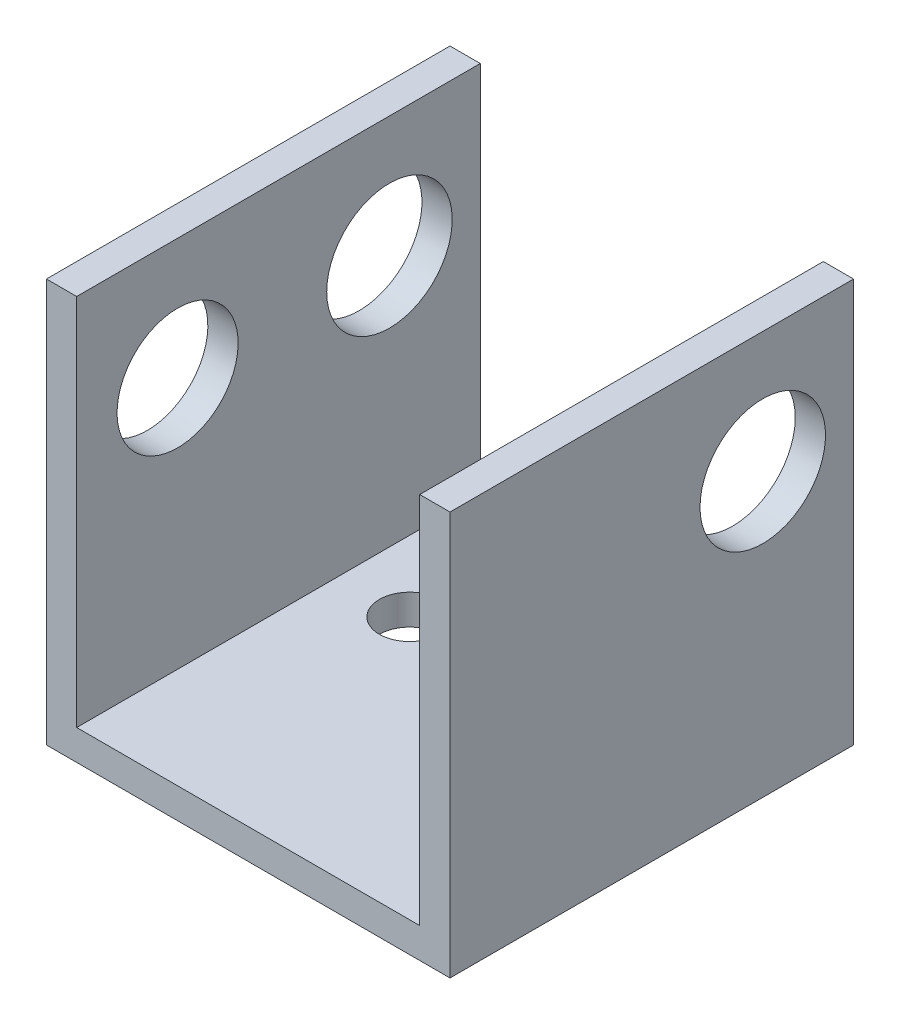
ISO-10303-21;
HEADER;
FILE_DESCRIPTION(('STEP AP214'),'2;1');
FILE_NAME('part.step','',(''),(''),'','','');
FILE_SCHEMA(('AUTOMOTIVE_DESIGN { 1 0 10303 214 1 1 1 1 }'));
ENDSEC;
DATA;
#1=APPLICATION_CONTEXT('core data for automotive mechanical design processes');
#2=APPLICATION_PROTOCOL_DEFINITION('international standard','automotive_design',2000,#1);
#3=PRODUCT_CONTEXT('',#1,'mechanical');
#4=PRODUCT('Part','Part','',(#3));
#5=PRODUCT_RELATED_PRODUCT_CATEGORY('part','',(#4));
#6=PRODUCT_DEFINITION_FORMATION('','',#4);
#7=PRODUCT_DEFINITION_CONTEXT('part definition',#1,'design');
#8=PRODUCT_DEFINITION('design','',#6,#7);
#9=PRODUCT_DEFINITION_SHAPE('','',#8);
#10=(LENGTH_UNIT() NAMED_UNIT(*) SI_UNIT(.MILLI.,.METRE.));
#11=(NAMED_UNIT(*) PLANE_ANGLE_UNIT() SI_UNIT($,.RADIAN.));
#12=(NAMED_UNIT(*) SI_UNIT($,.STERADIAN.) SOLID_ANGLE_UNIT());
#13=UNCERTAINTY_MEASURE_WITH_UNIT(LENGTH_MEASURE(1.E-05),#10,'distance_accuracy_value','');
#14=(GEOMETRIC_REPRESENTATION_CONTEXT(3) GLOBAL_UNCERTAINTY_ASSIGNED_CONTEXT((#13)) GLOBAL_UNIT_ASSIGNED_CONTEXT((#10,
#11,#12)) REPRESENTATION_CONTEXT('',''));
#15=CARTESIAN_POINT('',(0.,0.,0.));
#16=DIRECTION('',(0.,0.,1.));
#17=DIRECTION('',(1.,0.,0.));
#18=AXIS2_PLACEMENT_3D('',#15,#16,#17);
#19=CARTESIAN_POINT('',(-31.1485585296292,-16.6161569826708,20.));
#20=DIRECTION('',(1.,0.,0.));
#21=DIRECTION('',(0.,0.,-1.));
#22=AXIS2_PLACEMENT_3D('',#19,#20,#21);
#23=PLANE('',#22);
#24=CARTESIAN_POINT('',(-31.1485585296292,-2.61615698267076,4.5));
#25=DIRECTION('',(-1.,0.,0.));
#26=DIRECTION('',(0.,0.,1.));
#27=AXIS2_PLACEMENT_3D('',#24,#25,#26);
#28=CIRCLE('',#27,3.11);
#29=CARTESIAN_POINT('',(-31.1485585296292,-2.61615698267076,7.61));
#30=VERTEX_POINT('',#29);
#31=EDGE_CURVE('E197',#30,#30,#28,.T.);
#32=ORIENTED_EDGE('',*,*,#31,.F.);
#33=EDGE_LOOP('',(#32));
#34=FACE_BOUND('',#33,.T.);
#35=CARTESIAN_POINT('',(-31.1485585296292,-2.61615698267076,15.));
#36=DIRECTION('',(1.,0.,0.));
#37=DIRECTION('',(0.,1.,0.));
#38=AXIS2_PLACEMENT_3D('',#35,#36,#37);
#39=CIRCLE('',#38,3.);
#40=CARTESIAN_POINT('',(-31.1485585296292,0.383843017329241,15.));
#41=VERTEX_POINT('',#40);
#42=EDGE_CURVE('E186',#41,#41,#39,.T.);
#43=ORIENTED_EDGE('',*,*,#42,.T.);
#44=EDGE_LOOP('',(#43));
#45=FACE_BOUND('',#44,.T.);
#46=DIRECTION('',(0.,-1.,0.));
#47=VECTOR('',#46,1.);
#48=CARTESIAN_POINT('',(-31.1485585296292,-16.6161569826708,0.));
#49=LINE('',#48,#47);
#50=CARTESIAN_POINT('',(-31.1485585296292,3.38384301732924,0.));
#51=VERTEX_POINT('',#50);
#52=CARTESIAN_POINT('',(-31.1485585296292,-16.6161569826708,0.));
#53=VERTEX_POINT('',#52);
#54=EDGE_CURVE('E128',#51,#53,#49,.T.);
#55=ORIENTED_EDGE('',*,*,#54,.T.);
#56=DIRECTION('',(0.,0.,-1.));
#57=VECTOR('',#56,1.);
#58=CARTESIAN_POINT('',(-31.1485585296292,-16.6161569826708,20.));
#59=LINE('',#58,#57);
#60=CARTESIAN_POINT('',(-31.1485585296292,-16.6161569826708,20.));
#61=VERTEX_POINT('',#60);
#62=EDGE_CURVE('E11',#61,#53,#59,.T.);
#63=ORIENTED_EDGE('',*,*,#62,.F.);
#64=DIRECTION('',(0.,-1.,0.));
#65=VECTOR('',#64,1.);
#66=CARTESIAN_POINT('',(-31.1485585296292,-16.6161569826708,20.));
#67=LINE('',#66,#65);
#68=CARTESIAN_POINT('',(-31.1485585296292,3.38384301732924,20.));
#69=VERTEX_POINT('',#68);
#70=EDGE_CURVE('E143',#69,#61,#67,.T.);
#71=ORIENTED_EDGE('',*,*,#70,.F.);
#72=DIRECTION('',(0.,0.,-1.));
#73=VECTOR('',#72,1.);
#74=CARTESIAN_POINT('',(-31.1485585296292,3.38384301732924,20.));
#75=LINE('',#74,#73);
#76=EDGE_CURVE('E124',#69,#51,#75,.T.);
#77=ORIENTED_EDGE('',*,*,#76,.T.);
#78=EDGE_LOOP('',(#55,#63,#71,#77));
#79=FACE_BOUND('',#78,.T.);
#80=ADVANCED_FACE('F31',(#34,#45,#79),#23,.F.);
#81=CARTESIAN_POINT('',(-11.1485585296292,-16.6161569826708,20.));
#82=DIRECTION('',(0.,1.,0.));
#83=DIRECTION('',(-1.,0.,0.));
#84=AXIS2_PLACEMENT_3D('',#81,#82,#83);
#85=PLANE('',#84);
#86=CARTESIAN_POINT('',(-16.1485585296292,-16.6161569826708,13.));
#87=DIRECTION('',(0.,1.,0.));
#88=DIRECTION('',(-1.,0.,0.));
#89=AXIS2_PLACEMENT_3D('',#86,#87,#88);
#90=CIRCLE('',#89,1.5);
#91=CARTESIAN_POINT('',(-17.6485585296292,-16.6161569826708,13.));
#92=VERTEX_POINT('',#91);
#93=EDGE_CURVE('E180',#92,#92,#90,.T.);
#94=ORIENTED_EDGE('',*,*,#93,.T.);
#95=EDGE_LOOP('',(#94));
#96=FACE_BOUND('',#95,.T.);
#97=CARTESIAN_POINT('',(-26.1485585296292,-16.6161569826708,7.));
#98=DIRECTION('',(0.,1.,0.));
#99=DIRECTION('',(-1.,0.,0.));
#100=AXIS2_PLACEMENT_3D('',#97,#98,#99);
#101=CIRCLE('',#100,1.5);
#102=CARTESIAN_POINT('',(-27.6485585296292,-16.6161569826708,7.));
#103=VERTEX_POINT('',#102);
#104=EDGE_CURVE('E132',#103,#103,#101,.T.);
#105=ORIENTED_EDGE('',*,*,#104,.T.);
#106=EDGE_LOOP('',(#105));
#107=FACE_BOUND('',#106,.T.);
#108=DIRECTION('',(1.,0.,0.));
#109=VECTOR('',#108,1.);
#110=CARTESIAN_POINT('',(-11.1485585296292,-16.6161569826708,0.));
#111=LINE('',#110,#109);
#112=CARTESIAN_POINT('',(-11.1485585296292,-16.6161569826708,0.));
#113=VERTEX_POINT('',#112);
#114=EDGE_CURVE('E131',#53,#113,#111,.T.);
#115=ORIENTED_EDGE('',*,*,#114,.T.);
#116=DIRECTION('',(0.,0.,-1.));
#117=VECTOR('',#116,1.);
#118=CARTESIAN_POINT('',(-11.1485585296292,-16.6161569826708,20.));
#119=LINE('',#118,#117);
#120=CARTESIAN_POINT('',(-11.1485585296292,-16.6161569826708,20.));
#121=VERTEX_POINT('',#120);
#122=EDGE_CURVE('E40',#121,#113,#119,.T.);
#123=ORIENTED_EDGE('',*,*,#122,.F.);
#124=DIRECTION('',(1.,0.,0.));
#125=VECTOR('',#124,1.);
#126=CARTESIAN_POINT('',(-11.1485585296292,-16.6161569826708,20.));
#127=LINE('',#126,#125);
#128=EDGE_CURVE('E91',#61,#121,#127,.T.);
#129=ORIENTED_EDGE('',*,*,#128,.F.);
#130=ORIENTED_EDGE('',*,*,#62,.T.);
#131=EDGE_LOOP('',(#115,#123,#129,#130));
#132=FACE_BOUND('',#131,.T.);
#133=ADVANCED_FACE('F224',(#96,#107,#132),#85,.F.);
#134=CARTESIAN_POINT('',(-11.1485585296292,3.38384301732925,20.));
#135=DIRECTION('',(-1.,0.,0.));
#136=DIRECTION('',(0.,-1.,0.));
#137=AXIS2_PLACEMENT_3D('',#134,#135,#136);
#138=PLANE('',#137);
#139=CARTESIAN_POINT('',(-11.1485585296292,-2.61615698267076,4.5));
#140=DIRECTION('',(-1.,0.,0.));
#141=DIRECTION('',(0.,0.,1.));
#142=AXIS2_PLACEMENT_3D('',#139,#140,#141);
#143=CIRCLE('',#142,3.11);
#144=CARTESIAN_POINT('',(-11.1485585296292,-2.61615698267076,7.61));
#145=VERTEX_POINT('',#144);
#146=EDGE_CURVE('E200',#145,#145,#143,.T.);
#147=ORIENTED_EDGE('',*,*,#146,.T.);
#148=EDGE_LOOP('',(#147));
#149=FACE_BOUND('',#148,.T.);
#150=DIRECTION('',(0.,1.,0.));
#151=VECTOR('',#150,1.);
#152=CARTESIAN_POINT('',(-11.1485585296292,3.38384301732925,0.));
#153=LINE('',#152,#151);
#154=CARTESIAN_POINT('',(-11.1485585296292,3.38384301732925,0.));
#155=VERTEX_POINT('',#154);
#156=EDGE_CURVE('E134',#113,#155,#153,.T.);
#157=ORIENTED_EDGE('',*,*,#156,.T.);
#158=DIRECTION('',(0.,0.,-1.));
#159=VECTOR('',#158,1.);
#160=CARTESIAN_POINT('',(-11.1485585296292,3.38384301732925,20.));
#161=LINE('',#160,#159);
#162=CARTESIAN_POINT('',(-11.1485585296292,3.38384301732925,20.));
#163=VERTEX_POINT('',#162);
#164=EDGE_CURVE('E150',#163,#155,#161,.T.);
#165=ORIENTED_EDGE('',*,*,#164,.F.);
#166=DIRECTION('',(0.,1.,0.));
#167=VECTOR('',#166,1.);
#168=CARTESIAN_POINT('',(-11.1485585296292,3.38384301732925,20.));
#169=LINE('',#168,#167);
#170=EDGE_CURVE('E159',#121,#163,#169,.T.);
#171=ORIENTED_EDGE('',*,*,#170,.F.);
#172=ORIENTED_EDGE('',*,*,#122,.T.);
#173=EDGE_LOOP('',(#157,#165,#171,#172));
#174=FACE_BOUND('',#173,.T.);
#175=ADVANCED_FACE('F157',(#149,#174),#138,.F.);
#176=CARTESIAN_POINT('',(-12.6485585296292,3.38384301732925,20.));
#177=DIRECTION('',(0.,-1.,0.));
#178=DIRECTION('',(0.,0.,-1.));
#179=AXIS2_PLACEMENT_3D('',#176,#177,#178);
#180=PLANE('',#179);
#181=DIRECTION('',(-1.,0.,0.));
#182=VECTOR('',#181,1.);
#183=CARTESIAN_POINT('',(-12.6485585296292,3.38384301732925,0.));
#184=LINE('',#183,#182);
#185=CARTESIAN_POINT('',(-12.6485585296292,3.38384301732925,0.));
#186=VERTEX_POINT('',#185);
#187=EDGE_CURVE('E136',#155,#186,#184,.T.);
#188=ORIENTED_EDGE('',*,*,#187,.T.);
#189=DIRECTION('',(0.,0.,-1.));
#190=VECTOR('',#189,1.);
#191=CARTESIAN_POINT('',(-12.6485585296292,3.38384301732925,20.));
#192=LINE('',#191,#190);
#193=CARTESIAN_POINT('',(-12.6485585296292,3.38384301732925,20.));
#194=VERTEX_POINT('',#193);
#195=EDGE_CURVE('E147',#194,#186,#192,.T.);
#196=ORIENTED_EDGE('',*,*,#195,.F.);
#197=DIRECTION('',(-1.,0.,0.));
#198=VECTOR('',#197,1.);
#199=CARTESIAN_POINT('',(-12.6485585296292,3.38384301732925,20.));
#200=LINE('',#199,#198);
#201=EDGE_CURVE('E171',#163,#194,#200,.T.);
#202=ORIENTED_EDGE('',*,*,#201,.F.);
#203=ORIENTED_EDGE('',*,*,#164,.T.);
#204=EDGE_LOOP('',(#188,#196,#202,#203));
#205=FACE_BOUND('',#204,.T.);
#206=ADVANCED_FACE('F167',(#205),#180,.F.);
#207=CARTESIAN_POINT('',(-12.6485585296292,-15.1161569826708,20.));
#208=DIRECTION('',(1.,0.,0.));
#209=DIRECTION('',(0.,0.,-1.));
#210=AXIS2_PLACEMENT_3D('',#207,#208,#209);
#211=PLANE('',#210);
#212=CARTESIAN_POINT('',(-12.6485585296292,-2.61615698267076,4.5));
#213=DIRECTION('',(1.,0.,0.));
#214=DIRECTION('',(0.,0.,-1.));
#215=AXIS2_PLACEMENT_3D('',#212,#213,#214);
#216=CIRCLE('',#215,3.11);
#217=CARTESIAN_POINT('',(-12.6485585296292,-2.61615698267076,1.39));
#218=VERTEX_POINT('',#217);
#219=EDGE_CURVE('E192',#218,#218,#216,.T.);
#220=ORIENTED_EDGE('',*,*,#219,.T.);
#221=EDGE_LOOP('',(#220));
#222=FACE_BOUND('',#221,.T.);
#223=DIRECTION('',(0.,-1.,0.));
#224=VECTOR('',#223,1.);
#225=CARTESIAN_POINT('',(-12.6485585296292,-15.1161569826708,0.));
#226=LINE('',#225,#224);
#227=CARTESIAN_POINT('',(-12.6485585296292,-15.1161569826708,0.));
#228=VERTEX_POINT('',#227);
#229=EDGE_CURVE('E138',#186,#228,#226,.T.);
#230=ORIENTED_EDGE('',*,*,#229,.T.);
#231=DIRECTION('',(0.,0.,-1.));
#232=VECTOR('',#231,1.);
#233=CARTESIAN_POINT('',(-12.6485585296292,-15.1161569826708,20.));
#234=LINE('',#233,#232);
#235=CARTESIAN_POINT('',(-12.6485585296292,-15.1161569826708,20.));
#236=VERTEX_POINT('',#235);
#237=EDGE_CURVE('E119',#236,#228,#234,.T.);
#238=ORIENTED_EDGE('',*,*,#237,.F.);
#239=DIRECTION('',(0.,-1.,0.));
#240=VECTOR('',#239,1.);
#241=CARTESIAN_POINT('',(-12.6485585296292,-15.1161569826708,20.));
#242=LINE('',#241,#240);
#243=EDGE_CURVE('E110',#194,#236,#242,.T.);
#244=ORIENTED_EDGE('',*,*,#243,.F.);
#245=ORIENTED_EDGE('',*,*,#195,.T.);
#246=EDGE_LOOP('',(#230,#238,#244,#245));
#247=FACE_BOUND('',#246,.T.);
#248=ADVANCED_FACE('F170',(#222,#247),#211,.F.);
#249=CARTESIAN_POINT('',(-29.6485585296292,-15.1161569826708,20.));
#250=DIRECTION('',(0.,-1.,0.));
#251=DIRECTION('',(0.,0.,-1.));
#252=AXIS2_PLACEMENT_3D('',#249,#250,#251);
#253=PLANE('',#252);
#254=CARTESIAN_POINT('',(-16.1485585296292,-15.1161569826708,13.));
#255=DIRECTION('',(0.,1.,0.));
#256=DIRECTION('',(-1.,0.,0.));
#257=AXIS2_PLACEMENT_3D('',#254,#255,#256);
#258=CIRCLE('',#257,1.5);
#259=CARTESIAN_POINT('',(-17.6485585296292,-15.1161569826708,13.));
#260=VERTEX_POINT('',#259);
#261=EDGE_CURVE('E183',#260,#260,#258,.T.);
#262=ORIENTED_EDGE('',*,*,#261,.F.);
#263=EDGE_LOOP('',(#262));
#264=FACE_BOUND('',#263,.T.);
#265=CARTESIAN_POINT('',(-26.1485585296292,-15.1161569826708,7.));
#266=DIRECTION('',(0.,1.,0.));
#267=DIRECTION('',(-1.,0.,0.));
#268=AXIS2_PLACEMENT_3D('',#265,#266,#267);
#269=CIRCLE('',#268,1.5);
#270=CARTESIAN_POINT('',(-27.6485585296292,-15.1161569826708,7.));
#271=VERTEX_POINT('',#270);
#272=EDGE_CURVE('E177',#271,#271,#269,.T.);
#273=ORIENTED_EDGE('',*,*,#272,.F.);
#274=EDGE_LOOP('',(#273));
#275=FACE_BOUND('',#274,.T.);
#276=DIRECTION('',(-1.,0.,0.));
#277=VECTOR('',#276,1.);
#278=CARTESIAN_POINT('',(-29.6485585296292,-15.1161569826708,0.));
#279=LINE('',#278,#277);
#280=CARTESIAN_POINT('',(-29.6485585296292,-15.1161569826708,0.));
#281=VERTEX_POINT('',#280);
#282=EDGE_CURVE('E118',#228,#281,#279,.T.);
#283=ORIENTED_EDGE('',*,*,#282,.T.);
#284=DIRECTION('',(0.,0.,-1.));
#285=VECTOR('',#284,1.);
#286=CARTESIAN_POINT('',(-29.6485585296292,-15.1161569826708,20.));
#287=LINE('',#286,#285);
#288=CARTESIAN_POINT('',(-29.6485585296292,-15.1161569826708,20.));
#289=VERTEX_POINT('',#288);
#290=EDGE_CURVE('E115',#289,#281,#287,.T.);
#291=ORIENTED_EDGE('',*,*,#290,.F.);
#292=DIRECTION('',(-1.,0.,0.));
#293=VECTOR('',#292,1.);
#294=CARTESIAN_POINT('',(-29.6485585296292,-15.1161569826708,20.));
#295=LINE('',#294,#293);
#296=EDGE_CURVE('E104',#236,#289,#295,.T.);
#297=ORIENTED_EDGE('',*,*,#296,.F.);
#298=ORIENTED_EDGE('',*,*,#237,.T.);
#299=EDGE_LOOP('',(#283,#291,#297,#298));
#300=FACE_BOUND('',#299,.T.);
#301=ADVANCED_FACE('F116',(#264,#275,#300),#253,.F.);
#302=CARTESIAN_POINT('',(-29.6485585296292,3.38384301732924,20.));
#303=DIRECTION('',(-1.,0.,0.));
#304=DIRECTION('',(0.,-1.,0.));
#305=AXIS2_PLACEMENT_3D('',#302,#303,#304);
#306=PLANE('',#305);
#307=CARTESIAN_POINT('',(-29.6485585296292,-2.61615698267076,4.5));
#308=DIRECTION('',(-1.,0.,0.));
#309=DIRECTION('',(0.,-1.,0.));
#310=AXIS2_PLACEMENT_3D('',#307,#308,#309);
#311=CIRCLE('',#310,3.11);
#312=CARTESIAN_POINT('',(-29.6485585296292,-5.72615698267076,4.5));
#313=VERTEX_POINT('',#312);
#314=EDGE_CURVE('E34',#313,#313,#311,.T.);
#315=ORIENTED_EDGE('',*,*,#314,.T.);
#316=EDGE_LOOP('',(#315));
#317=FACE_BOUND('',#316,.T.);
#318=CARTESIAN_POINT('',(-29.6485585296292,-2.61615698267076,15.));
#319=DIRECTION('',(1.,0.,0.));
#320=DIRECTION('',(0.,1.,0.));
#321=AXIS2_PLACEMENT_3D('',#318,#319,#320);
#322=CIRCLE('',#321,3.);
#323=CARTESIAN_POINT('',(-29.6485585296292,0.383843017329242,15.));
#324=VERTEX_POINT('',#323);
#325=EDGE_CURVE('E189',#324,#324,#322,.T.);
#326=ORIENTED_EDGE('',*,*,#325,.F.);
#327=EDGE_LOOP('',(#326));
#328=FACE_BOUND('',#327,.T.);
#329=DIRECTION('',(0.,1.,0.));
#330=VECTOR('',#329,1.);
#331=CARTESIAN_POINT('',(-29.6485585296292,3.38384301732924,0.));
#332=LINE('',#331,#330);
#333=CARTESIAN_POINT('',(-29.6485585296292,3.38384301732924,0.));
#334=VERTEX_POINT('',#333);
#335=EDGE_CURVE('E77',#281,#334,#332,.T.);
#336=ORIENTED_EDGE('',*,*,#335,.T.);
#337=DIRECTION('',(0.,0.,-1.));
#338=VECTOR('',#337,1.);
#339=CARTESIAN_POINT('',(-29.6485585296292,3.38384301732924,20.));
#340=LINE('',#339,#338);
#341=CARTESIAN_POINT('',(-29.6485585296292,3.38384301732924,20.));
#342=VERTEX_POINT('',#341);
#343=EDGE_CURVE('E120',#342,#334,#340,.T.);
#344=ORIENTED_EDGE('',*,*,#343,.F.);
#345=DIRECTION('',(0.,1.,0.));
#346=VECTOR('',#345,1.);
#347=CARTESIAN_POINT('',(-29.6485585296292,3.38384301732924,20.));
#348=LINE('',#347,#346);
#349=EDGE_CURVE('E108',#289,#342,#348,.T.);
#350=ORIENTED_EDGE('',*,*,#349,.F.);
#351=ORIENTED_EDGE('',*,*,#290,.T.);
#352=EDGE_LOOP('',(#336,#344,#350,#351));
#353=FACE_BOUND('',#352,.T.);
#354=ADVANCED_FACE('F122',(#317,#328,#353),#306,.F.);
#355=CARTESIAN_POINT('',(-31.1485585296292,3.38384301732924,20.));
#356=DIRECTION('',(0.,-1.,0.));
#357=DIRECTION('',(0.,0.,-1.));
#358=AXIS2_PLACEMENT_3D('',#355,#356,#357);
#359=PLANE('',#358);
#360=DIRECTION('',(-1.,0.,0.));
#361=VECTOR('',#360,1.);
#362=CARTESIAN_POINT('',(-31.1485585296292,3.38384301732924,0.));
#363=LINE('',#362,#361);
#364=EDGE_CURVE('E83',#334,#51,#363,.T.);
#365=ORIENTED_EDGE('',*,*,#364,.T.);
#366=ORIENTED_EDGE('',*,*,#76,.F.);
#367=DIRECTION('',(-1.,0.,0.));
#368=VECTOR('',#367,1.);
#369=CARTESIAN_POINT('',(-31.1485585296292,3.38384301732924,20.));
#370=LINE('',#369,#368);
#371=EDGE_CURVE('E48',#342,#69,#370,.T.);
#372=ORIENTED_EDGE('',*,*,#371,.F.);
#373=ORIENTED_EDGE('',*,*,#343,.T.);
#374=EDGE_LOOP('',(#365,#366,#372,#373));
#375=FACE_BOUND('',#374,.T.);
#376=ADVANCED_FACE('F238',(#375),#359,.F.);
#377=CARTESIAN_POINT('',(-31.1485585296292,3.38384301732924,20.));
#378=DIRECTION('',(0.,0.,-1.));
#379=DIRECTION('',(-1.,0.,0.));
#380=AXIS2_PLACEMENT_3D('',#377,#378,#379);
#381=PLANE('',#380);
#382=ORIENTED_EDGE('',*,*,#70,.T.);
#383=ORIENTED_EDGE('',*,*,#128,.T.);
#384=ORIENTED_EDGE('',*,*,#170,.T.);
#385=ORIENTED_EDGE('',*,*,#201,.T.);
#386=ORIENTED_EDGE('',*,*,#243,.T.);
#387=ORIENTED_EDGE('',*,*,#296,.T.);
#388=ORIENTED_EDGE('',*,*,#349,.T.);
#389=ORIENTED_EDGE('',*,*,#371,.T.);
#390=EDGE_LOOP('',(#382,#383,#384,#385,#386,#387,#388,#389));
#391=FACE_BOUND('',#390,.T.);
#392=ADVANCED_FACE('F106',(#391),#381,.F.);
#393=CARTESIAN_POINT('',(-31.1485585296292,3.38384301732924,0.));
#394=DIRECTION('',(0.,0.,-1.));
#395=DIRECTION('',(-1.,0.,0.));
#396=AXIS2_PLACEMENT_3D('',#393,#394,#395);
#397=PLANE('',#396);
#398=ORIENTED_EDGE('',*,*,#54,.F.);
#399=ORIENTED_EDGE('',*,*,#364,.F.);
#400=ORIENTED_EDGE('',*,*,#335,.F.);
#401=ORIENTED_EDGE('',*,*,#282,.F.);
#402=ORIENTED_EDGE('',*,*,#229,.F.);
#403=ORIENTED_EDGE('',*,*,#187,.F.);
#404=ORIENTED_EDGE('',*,*,#156,.F.);
#405=ORIENTED_EDGE('',*,*,#114,.F.);
#406=EDGE_LOOP('',(#398,#399,#400,#401,#402,#403,#404,#405));
#407=FACE_BOUND('',#406,.T.);
#408=ADVANCED_FACE('F163',(#407),#397,.T.);
#409=CARTESIAN_POINT('',(-26.1485585296292,-16.6161569826708,7.));
#410=DIRECTION('',(0.,1.,0.));
#411=DIRECTION('',(-1.,0.,0.));
#412=AXIS2_PLACEMENT_3D('',#409,#410,#411);
#413=CYLINDRICAL_SURFACE('',#412,1.5);
#414=ORIENTED_EDGE('',*,*,#104,.F.);
#415=EDGE_LOOP('',(#414));
#416=FACE_BOUND('',#415,.T.);
#417=ORIENTED_EDGE('',*,*,#272,.T.);
#418=EDGE_LOOP('',(#417));
#419=FACE_BOUND('',#418,.T.);
#420=ADVANCED_FACE('F289',(#416,#419),#413,.F.);
#421=CARTESIAN_POINT('',(-16.1485585296292,-16.6161569826708,13.));
#422=DIRECTION('',(0.,1.,0.));
#423=DIRECTION('',(-1.,0.,0.));
#424=AXIS2_PLACEMENT_3D('',#421,#422,#423);
#425=CYLINDRICAL_SURFACE('',#424,1.5);
#426=ORIENTED_EDGE('',*,*,#93,.F.);
#427=EDGE_LOOP('',(#426));
#428=FACE_BOUND('',#427,.T.);
#429=ORIENTED_EDGE('',*,*,#261,.T.);
#430=EDGE_LOOP('',(#429));
#431=FACE_BOUND('',#430,.T.);
#432=ADVANCED_FACE('F220',(#428,#431),#425,.F.);
#433=CARTESIAN_POINT('',(-31.1485585296292,-2.61615698267076,15.));
#434=DIRECTION('',(1.,0.,0.));
#435=DIRECTION('',(0.,1.,0.));
#436=AXIS2_PLACEMENT_3D('',#433,#434,#435);
#437=CYLINDRICAL_SURFACE('',#436,3.);
#438=ORIENTED_EDGE('',*,*,#42,.F.);
#439=EDGE_LOOP('',(#438));
#440=FACE_BOUND('',#439,.T.);
#441=ORIENTED_EDGE('',*,*,#325,.T.);
#442=EDGE_LOOP('',(#441));
#443=FACE_BOUND('',#442,.T.);
#444=ADVANCED_FACE('F212',(#440,#443),#437,.F.);
#445=CARTESIAN_POINT('',(-11.1485585296292,-2.61615698267076,4.5));
#446=DIRECTION('',(-1.,0.,0.));
#447=DIRECTION('',(0.,0.,1.));
#448=AXIS2_PLACEMENT_3D('',#445,#446,#447);
#449=CYLINDRICAL_SURFACE('',#448,3.11);
#450=ORIENTED_EDGE('',*,*,#31,.T.);
#451=EDGE_LOOP('',(#450));
#452=FACE_BOUND('',#451,.T.);
#453=ORIENTED_EDGE('',*,*,#314,.F.);
#454=EDGE_LOOP('',(#453));
#455=FACE_BOUND('',#454,.T.);
#456=ADVANCED_FACE('F209',(#452,#455),#449,.F.);
#457=ORIENTED_EDGE('',*,*,#146,.F.);
#458=EDGE_LOOP('',(#457));
#459=FACE_BOUND('',#458,.T.);
#460=ORIENTED_EDGE('',*,*,#219,.F.);
#461=EDGE_LOOP('',(#460));
#462=FACE_BOUND('',#461,.T.);
#463=ADVANCED_FACE('F211',(#459,#462),#449,.F.);
#464=CLOSED_SHELL('',(#80,#133,#175,#206,#248,#301,#354,#376,#392,#408,#420,#432,#444,#456,#463));
#465=MANIFOLD_SOLID_BREP('B2',#464);
#466=ADVANCED_BREP_SHAPE_REPRESENTATION('',(#18,#465),#14);
#467=SHAPE_DEFINITION_REPRESENTATION(#9,#466);
ENDSEC;
END-ISO-10303-21;
